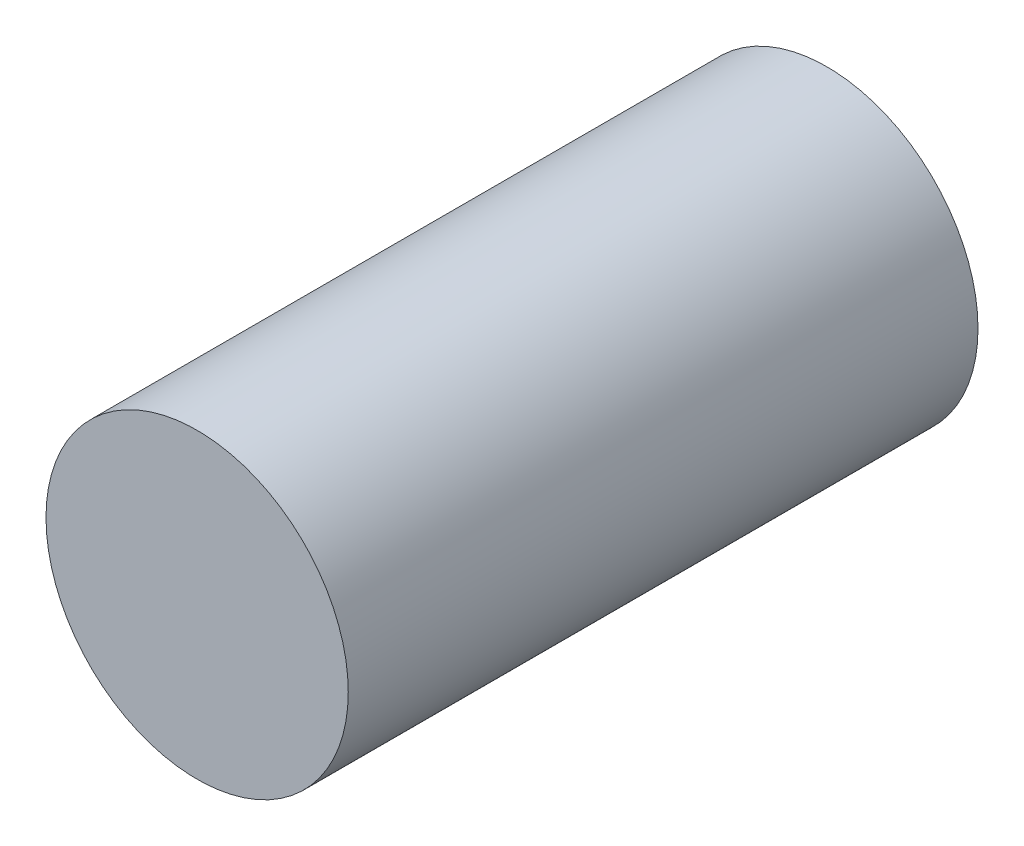
ISO-10303-21;
HEADER;
FILE_DESCRIPTION(('STEP AP214'),'2;1');
FILE_NAME('part.step','',(''),(''),'','','');
FILE_SCHEMA(('AUTOMOTIVE_DESIGN { 1 0 10303 214 1 1 1 1 }'));
ENDSEC;
DATA;
#1=APPLICATION_CONTEXT('core data for automotive mechanical design processes');
#2=APPLICATION_PROTOCOL_DEFINITION('international standard','automotive_design',2000,#1);
#3=PRODUCT_CONTEXT('',#1,'mechanical');
#4=PRODUCT('Part','Part','',(#3));
#5=PRODUCT_RELATED_PRODUCT_CATEGORY('part','',(#4));
#6=PRODUCT_DEFINITION_FORMATION('','',#4);
#7=PRODUCT_DEFINITION_CONTEXT('part definition',#1,'design');
#8=PRODUCT_DEFINITION('design','',#6,#7);
#9=PRODUCT_DEFINITION_SHAPE('','',#8);
#10=(LENGTH_UNIT() NAMED_UNIT(*) SI_UNIT(.MILLI.,.METRE.));
#11=(NAMED_UNIT(*) PLANE_ANGLE_UNIT() SI_UNIT($,.RADIAN.));
#12=(NAMED_UNIT(*) SI_UNIT($,.STERADIAN.) SOLID_ANGLE_UNIT());
#13=UNCERTAINTY_MEASURE_WITH_UNIT(LENGTH_MEASURE(1.E-05),#10,'distance_accuracy_value','');
#14=(GEOMETRIC_REPRESENTATION_CONTEXT(3) GLOBAL_UNCERTAINTY_ASSIGNED_CONTEXT((#13)) GLOBAL_UNIT_ASSIGNED_CONTEXT((#10,
#11,#12)) REPRESENTATION_CONTEXT('',''));
#15=CARTESIAN_POINT('',(0.,0.,0.));
#16=DIRECTION('',(0.,0.,1.));
#17=DIRECTION('',(1.,0.,0.));
#18=AXIS2_PLACEMENT_3D('',#15,#16,#17);
#19=CARTESIAN_POINT('',(0.,0.,25.));
#20=DIRECTION('',(0.,0.,-1.));
#21=DIRECTION('',(-1.,0.,0.));
#22=AXIS2_PLACEMENT_3D('',#19,#20,#21);
#23=CYLINDRICAL_SURFACE('',#22,6.);
#24=CARTESIAN_POINT('',(0.,0.,25.));
#25=DIRECTION('',(0.,0.,1.));
#26=DIRECTION('',(1.,0.,0.));
#27=AXIS2_PLACEMENT_3D('',#24,#25,#26);
#28=CIRCLE('',#27,6.);
#29=CARTESIAN_POINT('',(6.,0.,25.));
#30=VERTEX_POINT('',#29);
#31=EDGE_CURVE('E10',#30,#30,#28,.T.);
#32=ORIENTED_EDGE('',*,*,#31,.F.);
#33=EDGE_LOOP('',(#32));
#34=FACE_BOUND('',#33,.T.);
#35=CARTESIAN_POINT('',(0.,0.,0.));
#36=DIRECTION('',(0.,0.,1.));
#37=DIRECTION('',(1.,0.,0.));
#38=AXIS2_PLACEMENT_3D('',#35,#36,#37);
#39=CIRCLE('',#38,6.);
#40=CARTESIAN_POINT('',(6.,0.,0.));
#41=VERTEX_POINT('',#40);
#42=EDGE_CURVE('E34',#41,#41,#39,.T.);
#43=ORIENTED_EDGE('',*,*,#42,.T.);
#44=EDGE_LOOP('',(#43));
#45=FACE_BOUND('',#44,.T.);
#46=ADVANCED_FACE('F31',(#34,#45),#23,.T.);
#47=CARTESIAN_POINT('',(0.,0.,25.));
#48=DIRECTION('',(0.,0.,1.));
#49=DIRECTION('',(1.,0.,0.));
#50=AXIS2_PLACEMENT_3D('',#47,#48,#49);
#51=PLANE('',#50);
#52=ORIENTED_EDGE('',*,*,#31,.T.);
#53=EDGE_LOOP('',(#52));
#54=FACE_BOUND('',#53,.T.);
#55=ADVANCED_FACE('F46',(#54),#51,.T.);
#56=CARTESIAN_POINT('',(0.,0.,0.));
#57=DIRECTION('',(0.,0.,1.));
#58=DIRECTION('',(1.,0.,0.));
#59=AXIS2_PLACEMENT_3D('',#56,#57,#58);
#60=PLANE('',#59);
#61=ORIENTED_EDGE('',*,*,#42,.F.);
#62=EDGE_LOOP('',(#61));
#63=FACE_BOUND('',#62,.T.);
#64=ADVANCED_FACE('F44',(#63),#60,.F.);
#65=CLOSED_SHELL('',(#46,#55,#64));
#66=MANIFOLD_SOLID_BREP('B2',#65);
#67=ADVANCED_BREP_SHAPE_REPRESENTATION('',(#18,#66),#14);
#68=SHAPE_DEFINITION_REPRESENTATION(#9,#67);
ENDSEC;
END-ISO-10303-21;
